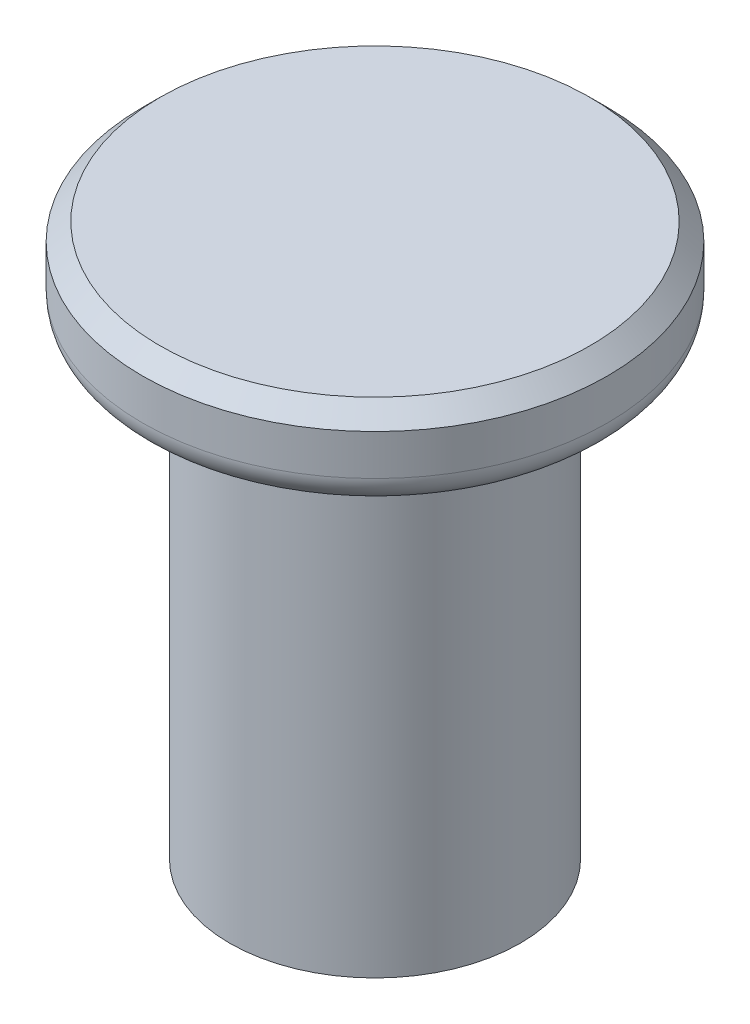
ISO-10303-21;
HEADER;
FILE_DESCRIPTION(('STEP AP214'),'2;1');
FILE_NAME('part.step','',(''),(''),'','','');
FILE_SCHEMA(('AUTOMOTIVE_DESIGN { 1 0 10303 214 1 1 1 1 }'));
ENDSEC;
DATA;
#1=APPLICATION_CONTEXT('core data for automotive mechanical design processes');
#2=APPLICATION_PROTOCOL_DEFINITION('international standard','automotive_design',2000,#1);
#3=PRODUCT_CONTEXT('',#1,'mechanical');
#4=PRODUCT('Part','Part','',(#3));
#5=PRODUCT_RELATED_PRODUCT_CATEGORY('part','',(#4));
#6=PRODUCT_DEFINITION_FORMATION('','',#4);
#7=PRODUCT_DEFINITION_CONTEXT('part definition',#1,'design');
#8=PRODUCT_DEFINITION('design','',#6,#7);
#9=PRODUCT_DEFINITION_SHAPE('','',#8);
#10=(LENGTH_UNIT() NAMED_UNIT(*) SI_UNIT(.MILLI.,.METRE.));
#11=(NAMED_UNIT(*) PLANE_ANGLE_UNIT() SI_UNIT($,.RADIAN.));
#12=(NAMED_UNIT(*) SI_UNIT($,.STERADIAN.) SOLID_ANGLE_UNIT());
#13=UNCERTAINTY_MEASURE_WITH_UNIT(LENGTH_MEASURE(1.E-05),#10,'distance_accuracy_value','');
#14=(GEOMETRIC_REPRESENTATION_CONTEXT(3) GLOBAL_UNCERTAINTY_ASSIGNED_CONTEXT((#13)) GLOBAL_UNIT_ASSIGNED_CONTEXT((#10,
#11,#12)) REPRESENTATION_CONTEXT('',''));
#15=CARTESIAN_POINT('',(0.,0.,0.));
#16=DIRECTION('',(0.,0.,1.));
#17=DIRECTION('',(1.,0.,0.));
#18=AXIS2_PLACEMENT_3D('',#15,#16,#17);
#19=CARTESIAN_POINT('',(0.,-23.2627595748722,0.));
#20=DIRECTION('',(0.,1.,0.));
#21=DIRECTION('',(-1.,0.,0.));
#22=AXIS2_PLACEMENT_3D('',#19,#20,#21);
#23=PLANE('',#22);
#24=CARTESIAN_POINT('',(0.,-23.2627595748722,0.));
#25=DIRECTION('',(0.,1.,0.));
#26=DIRECTION('',(-1.,0.,0.));
#27=AXIS2_PLACEMENT_3D('',#24,#25,#26);
#28=CIRCLE('',#27,3.69999999999982);
#29=CARTESIAN_POINT('',(-3.69999999999973,-23.2627595748722,0.));
#30=VERTEX_POINT('',#29);
#31=EDGE_CURVE('E42',#30,#30,#28,.T.);
#32=ORIENTED_EDGE('',*,*,#31,.T.);
#33=EDGE_LOOP('',(#32));
#34=FACE_BOUND('',#33,.T.);
#35=ADVANCED_FACE('F31',(#34),#23,.T.);
#36=CARTESIAN_POINT('',(3.49148133884313E-12,-1000.,0.));
#37=DIRECTION('',(0.,-1.,0.));
#38=DIRECTION('',(1.,0.,0.));
#39=AXIS2_PLACEMENT_3D('',#36,#37,#38);
#40=CYLINDRICAL_SURFACE('',#39,3.99999999999992);
#41=CARTESIAN_POINT('',(0.,-24.2627595748721,0.));
#42=DIRECTION('',(0.,-1.,0.));
#43=DIRECTION('',(1.,0.,0.));
#44=AXIS2_PLACEMENT_3D('',#41,#42,#43);
#45=CIRCLE('',#44,3.99999999999992);
#46=CARTESIAN_POINT('',(4.,-24.2627595748721,0.));
#47=VERTEX_POINT('',#46);
#48=EDGE_CURVE('E10',#47,#47,#45,.F.);
#49=ORIENTED_EDGE('',*,*,#48,.T.);
#50=EDGE_LOOP('',(#49));
#51=FACE_BOUND('',#50,.T.);
#52=CARTESIAN_POINT('',(0.,-23.5627595748722,0.));
#53=DIRECTION('',(0.,1.,0.));
#54=DIRECTION('',(-1.,0.,0.));
#55=AXIS2_PLACEMENT_3D('',#52,#53,#54);
#56=CIRCLE('',#55,3.99999999999992);
#57=CARTESIAN_POINT('',(-3.99999999999983,-23.5627595748722,0.));
#58=VERTEX_POINT('',#57);
#59=EDGE_CURVE('E46',#58,#58,#56,.F.);
#60=ORIENTED_EDGE('',*,*,#59,.T.);
#61=EDGE_LOOP('',(#60));
#62=FACE_BOUND('',#61,.T.);
#63=ADVANCED_FACE('F71',(#51,#62),#40,.T.);
#64=CARTESIAN_POINT('',(4.,-24.7627595748722,0.));
#65=DIRECTION('',(0.,-1.,0.));
#66=DIRECTION('',(1.,0.,0.));
#67=AXIS2_PLACEMENT_3D('',#64,#65,#66);
#68=PLANE('',#67);
#69=CARTESIAN_POINT('',(0.,-24.7627595748722,0.));
#70=DIRECTION('',(0.,-1.,0.));
#71=DIRECTION('',(1.,0.,0.));
#72=AXIS2_PLACEMENT_3D('',#69,#70,#71);
#73=CIRCLE('',#72,3.49999999999992);
#74=CARTESIAN_POINT('',(3.5,-24.7627595748722,0.));
#75=VERTEX_POINT('',#74);
#76=EDGE_CURVE('E38',#75,#75,#73,.T.);
#77=ORIENTED_EDGE('',*,*,#76,.T.);
#78=EDGE_LOOP('',(#77));
#79=FACE_BOUND('',#78,.T.);
#80=CARTESIAN_POINT('',(0.,-24.7627595748722,0.));
#81=DIRECTION('',(0.,-1.,0.));
#82=DIRECTION('',(1.,0.,0.));
#83=AXIS2_PLACEMENT_3D('',#80,#81,#82);
#84=CIRCLE('',#83,2.49999999999991);
#85=CARTESIAN_POINT('',(2.5,-24.7627595748722,0.));
#86=VERTEX_POINT('',#85);
#87=EDGE_CURVE('E51',#86,#86,#84,.T.);
#88=ORIENTED_EDGE('',*,*,#87,.F.);
#89=EDGE_LOOP('',(#88));
#90=FACE_BOUND('',#89,.T.);
#91=ADVANCED_FACE('F62',(#79,#90),#68,.T.);
#92=CARTESIAN_POINT('',(3.49148133884313E-12,-1000.,0.));
#93=DIRECTION('',(0.,-1.,0.));
#94=DIRECTION('',(1.,0.,0.));
#95=AXIS2_PLACEMENT_3D('',#92,#93,#94);
#96=CYLINDRICAL_SURFACE('',#95,2.4999999999999);
#97=ORIENTED_EDGE('',*,*,#87,.T.);
#98=EDGE_LOOP('',(#97));
#99=FACE_BOUND('',#98,.T.);
#100=CARTESIAN_POINT('',(1.14390563664671E-13,-32.7627595748722,0.));
#101=DIRECTION('',(0.,-1.,0.));
#102=DIRECTION('',(1.,0.,0.));
#103=AXIS2_PLACEMENT_3D('',#100,#101,#102);
#104=CIRCLE('',#103,2.49999999999989);
#105=CARTESIAN_POINT('',(2.5,-32.7627595748722,0.));
#106=VERTEX_POINT('',#105);
#107=EDGE_CURVE('E54',#106,#106,#104,.T.);
#108=ORIENTED_EDGE('',*,*,#107,.F.);
#109=EDGE_LOOP('',(#108));
#110=FACE_BOUND('',#109,.T.);
#111=ADVANCED_FACE('F60',(#99,#110),#96,.T.);
#112=CARTESIAN_POINT('',(2.5,-32.7627595748722,0.));
#113=DIRECTION('',(0.,-1.,0.));
#114=DIRECTION('',(1.,0.,0.));
#115=AXIS2_PLACEMENT_3D('',#112,#113,#114);
#116=PLANE('',#115);
#117=ORIENTED_EDGE('',*,*,#107,.T.);
#118=EDGE_LOOP('',(#117));
#119=FACE_BOUND('',#118,.T.);
#120=ADVANCED_FACE('F58',(#119),#116,.T.);
#121=CARTESIAN_POINT('',(0.,-23.5627595748722,0.));
#122=DIRECTION('',(0.,-1.,0.));
#123=DIRECTION('',(1.,0.,0.));
#124=AXIS2_PLACEMENT_3D('',#121,#122,#123);
#125=CONICAL_SURFACE('',#124,3.99999999999992,0.785398163397602);
#126=ORIENTED_EDGE('',*,*,#31,.F.);
#127=EDGE_LOOP('',(#126));
#128=FACE_BOUND('',#127,.T.);
#129=ORIENTED_EDGE('',*,*,#59,.F.);
#130=EDGE_LOOP('',(#129));
#131=FACE_BOUND('',#130,.T.);
#132=ADVANCED_FACE('F69',(#128,#131),#125,.T.);
#133=CARTESIAN_POINT('',(0.,-24.2627595748721,0.));
#134=DIRECTION('',(0.,-1.,0.));
#135=DIRECTION('',(1.,0.,0.));
#136=AXIS2_PLACEMENT_3D('',#133,#134,#135);
#137=TOROIDAL_SURFACE('',#136,3.49999999999992,0.5);
#138=ORIENTED_EDGE('',*,*,#48,.F.);
#139=EDGE_LOOP('',(#138));
#140=FACE_BOUND('',#139,.T.);
#141=ORIENTED_EDGE('',*,*,#76,.F.);
#142=EDGE_LOOP('',(#141));
#143=FACE_BOUND('',#142,.T.);
#144=ADVANCED_FACE('F33',(#140,#143),#137,.T.);
#145=CLOSED_SHELL('',(#35,#63,#91,#111,#120,#132,#144));
#146=MANIFOLD_SOLID_BREP('B2',#145);
#147=ADVANCED_BREP_SHAPE_REPRESENTATION('',(#18,#146),#14);
#148=SHAPE_DEFINITION_REPRESENTATION(#9,#147);
ENDSEC;
END-ISO-10303-21;
